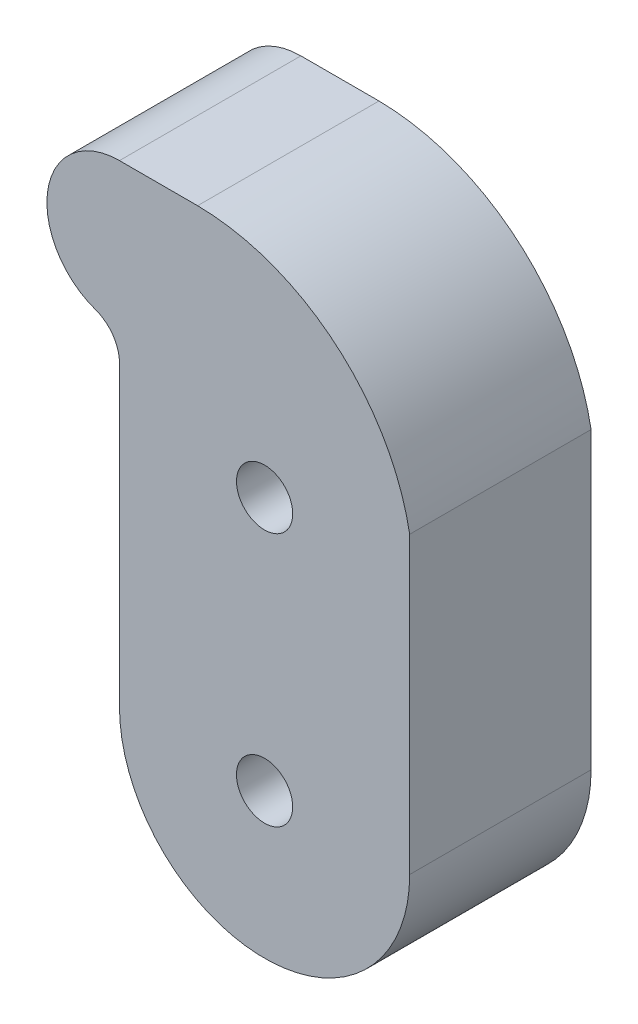
ISO-10303-21;
HEADER;
FILE_DESCRIPTION(('STEP AP214'),'2;1');
FILE_NAME('part.step','',(''),(''),'','','');
FILE_SCHEMA(('AUTOMOTIVE_DESIGN { 1 0 10303 214 1 1 1 1 }'));
ENDSEC;
DATA;
#1=APPLICATION_CONTEXT('core data for automotive mechanical design processes');
#2=APPLICATION_PROTOCOL_DEFINITION('international standard','automotive_design',2000,#1);
#3=PRODUCT_CONTEXT('',#1,'mechanical');
#4=PRODUCT('Part','Part','',(#3));
#5=PRODUCT_RELATED_PRODUCT_CATEGORY('part','',(#4));
#6=PRODUCT_DEFINITION_FORMATION('','',#4);
#7=PRODUCT_DEFINITION_CONTEXT('part definition',#1,'design');
#8=PRODUCT_DEFINITION('design','',#6,#7);
#9=PRODUCT_DEFINITION_SHAPE('','',#8);
#10=(LENGTH_UNIT() NAMED_UNIT(*) SI_UNIT(.MILLI.,.METRE.));
#11=(NAMED_UNIT(*) PLANE_ANGLE_UNIT() SI_UNIT($,.RADIAN.));
#12=(NAMED_UNIT(*) SI_UNIT($,.STERADIAN.) SOLID_ANGLE_UNIT());
#13=UNCERTAINTY_MEASURE_WITH_UNIT(LENGTH_MEASURE(1.E-05),#10,'distance_accuracy_value','');
#14=(GEOMETRIC_REPRESENTATION_CONTEXT(3) GLOBAL_UNCERTAINTY_ASSIGNED_CONTEXT((#13)) GLOBAL_UNIT_ASSIGNED_CONTEXT((#10,
#11,#12)) REPRESENTATION_CONTEXT('',''));
#15=CARTESIAN_POINT('',(0.,0.,0.));
#16=DIRECTION('',(0.,0.,1.));
#17=DIRECTION('',(1.,0.,0.));
#18=AXIS2_PLACEMENT_3D('',#15,#16,#17);
#19=CARTESIAN_POINT('',(-179.23884135027,71.6176801502978,10.));
#20=DIRECTION('',(0.,0.,1.));
#21=DIRECTION('',(1.,0.,0.));
#22=AXIS2_PLACEMENT_3D('',#19,#20,#21);
#23=PLANE('',#22);
#24=CARTESIAN_POINT('',(-175.434880274015,57.530770571063,10.));
#25=DIRECTION('',(0.,0.,1.));
#26=DIRECTION('',(1.,0.,0.));
#27=AXIS2_PLACEMENT_3D('',#24,#25,#26);
#28=CIRCLE('',#27,1.5499999999994);
#29=CARTESIAN_POINT('',(-173.884880274016,57.530770571063,10.));
#30=VERTEX_POINT('',#29);
#31=EDGE_CURVE('E130',#30,#30,#28,.T.);
#32=ORIENTED_EDGE('',*,*,#31,.F.);
#33=EDGE_LOOP('',(#32));
#34=FACE_BOUND('',#33,.T.);
#35=CARTESIAN_POINT('',(-179.23884135027,71.6176801502978,10.));
#36=DIRECTION('',(0.,0.,1.));
#37=DIRECTION('',(1.,0.,0.));
#38=AXIS2_PLACEMENT_3D('',#35,#36,#37);
#39=CIRCLE('',#38,12.);
#40=CARTESIAN_POINT('',(-167.434880274016,73.7778891471937,10.));
#41=VERTEX_POINT('',#40);
#42=CARTESIAN_POINT('',(-179.126801066159,83.6171570961791,10.));
#43=VERTEX_POINT('',#42);
#44=EDGE_CURVE('E139',#41,#43,#39,.T.);
#45=ORIENTED_EDGE('',*,*,#44,.T.);
#46=DIRECTION('',(-1.,0.,0.));
#47=VECTOR('',#46,1.);
#48=CARTESIAN_POINT('',(-179.126801066159,83.6171570961791,10.));
#49=LINE('',#48,#47);
#50=CARTESIAN_POINT('',(-183.434880274016,83.6171570961791,10.));
#51=VERTEX_POINT('',#50);
#52=EDGE_CURVE('E92',#43,#51,#49,.T.);
#53=ORIENTED_EDGE('',*,*,#52,.T.);
#54=CARTESIAN_POINT('',(-183.434880274013,79.6171570961765,10.));
#55=DIRECTION('',(0.,0.,1.));
#56=DIRECTION('',(1.,0.,0.));
#57=AXIS2_PLACEMENT_3D('',#54,#55,#56);
#58=CIRCLE('',#57,4.00000000000237);
#59=CARTESIAN_POINT('',(-184.768213607349,75.8459209298465,10.));
#60=VERTEX_POINT('',#59);
#61=EDGE_CURVE('E151',#51,#60,#58,.T.);
#62=ORIENTED_EDGE('',*,*,#61,.T.);
#63=CARTESIAN_POINT('',(-185.434880274016,73.9603028466822,10.));
#64=DIRECTION('',(0.,0.,-1.));
#65=DIRECTION('',(1.,0.,0.));
#66=AXIS2_PLACEMENT_3D('',#63,#64,#65);
#67=CIRCLE('',#66,2.00000000000058);
#68=CARTESIAN_POINT('',(-183.434880274015,73.9603028466835,10.));
#69=VERTEX_POINT('',#68);
#70=EDGE_CURVE('E108',#60,#69,#67,.T.);
#71=ORIENTED_EDGE('',*,*,#70,.T.);
#72=DIRECTION('',(0.,-1.,0.));
#73=VECTOR('',#72,1.);
#74=CARTESIAN_POINT('',(-183.434880274015,73.9603028466835,10.));
#75=LINE('',#74,#73);
#76=CARTESIAN_POINT('',(-183.434880274015,57.530770571061,10.));
#77=VERTEX_POINT('',#76);
#78=EDGE_CURVE('E102',#69,#77,#75,.T.);
#79=ORIENTED_EDGE('',*,*,#78,.T.);
#80=CARTESIAN_POINT('',(-175.434880274015,57.530770571063,10.));
#81=DIRECTION('',(0.,0.,1.));
#82=DIRECTION('',(1.,0.,0.));
#83=AXIS2_PLACEMENT_3D('',#80,#81,#82);
#84=CIRCLE('',#83,7.99999999999984);
#85=CARTESIAN_POINT('',(-167.434880274015,57.5307705710631,10.));
#86=VERTEX_POINT('',#85);
#87=EDGE_CURVE('E106',#77,#86,#84,.T.);
#88=ORIENTED_EDGE('',*,*,#87,.T.);
#89=DIRECTION('',(0.,1.,0.));
#90=VECTOR('',#89,1.);
#91=CARTESIAN_POINT('',(-167.434880274015,57.5307705710631,10.));
#92=LINE('',#91,#90);
#93=EDGE_CURVE('E52',#86,#41,#92,.T.);
#94=ORIENTED_EDGE('',*,*,#93,.T.);
#95=EDGE_LOOP('',(#45,#53,#62,#71,#79,#88,#94));
#96=FACE_BOUND('',#95,.T.);
#97=CARTESIAN_POINT('',(-175.434880274019,71.530770571063,10.));
#98=DIRECTION('',(0.,0.,1.));
#99=DIRECTION('',(1.,0.,0.));
#100=AXIS2_PLACEMENT_3D('',#97,#98,#99);
#101=CIRCLE('',#100,1.55000000000065);
#102=CARTESIAN_POINT('',(-173.884880274018,71.530770571063,10.));
#103=VERTEX_POINT('',#102);
#104=EDGE_CURVE('E166',#103,#103,#101,.T.);
#105=ORIENTED_EDGE('',*,*,#104,.F.);
#106=EDGE_LOOP('',(#105));
#107=FACE_BOUND('',#106,.T.);
#108=ADVANCED_FACE('F35',(#34,#96,#107),#23,.T.);
#109=CARTESIAN_POINT('',(-179.23884135027,71.6176801502978,0.));
#110=DIRECTION('',(0.,0.,1.));
#111=DIRECTION('',(1.,0.,0.));
#112=AXIS2_PLACEMENT_3D('',#109,#110,#111);
#113=PLANE('',#112);
#114=CARTESIAN_POINT('',(-175.434880274015,57.530770571063,0.));
#115=DIRECTION('',(0.,0.,1.));
#116=DIRECTION('',(1.,0.,0.));
#117=AXIS2_PLACEMENT_3D('',#114,#115,#116);
#118=CIRCLE('',#117,1.5499999999994);
#119=CARTESIAN_POINT('',(-173.884880274016,57.530770571063,0.));
#120=VERTEX_POINT('',#119);
#121=EDGE_CURVE('E163',#120,#120,#118,.T.);
#122=ORIENTED_EDGE('',*,*,#121,.T.);
#123=EDGE_LOOP('',(#122));
#124=FACE_BOUND('',#123,.T.);
#125=CARTESIAN_POINT('',(-179.23884135027,71.6176801502978,0.));
#126=DIRECTION('',(0.,0.,1.));
#127=DIRECTION('',(1.,0.,0.));
#128=AXIS2_PLACEMENT_3D('',#125,#126,#127);
#129=CIRCLE('',#128,12.);
#130=CARTESIAN_POINT('',(-167.434880274016,73.7778891471937,0.));
#131=VERTEX_POINT('',#130);
#132=CARTESIAN_POINT('',(-179.126801066159,83.6171570961791,0.));
#133=VERTEX_POINT('',#132);
#134=EDGE_CURVE('E126',#131,#133,#129,.T.);
#135=ORIENTED_EDGE('',*,*,#134,.F.);
#136=DIRECTION('',(0.,1.,0.));
#137=VECTOR('',#136,1.);
#138=CARTESIAN_POINT('',(-167.434880274015,57.5307705710631,0.));
#139=LINE('',#138,#137);
#140=CARTESIAN_POINT('',(-167.434880274015,57.5307705710631,0.));
#141=VERTEX_POINT('',#140);
#142=EDGE_CURVE('E84',#141,#131,#139,.T.);
#143=ORIENTED_EDGE('',*,*,#142,.F.);
#144=CARTESIAN_POINT('',(-175.434880274015,57.530770571063,0.));
#145=DIRECTION('',(0.,0.,1.));
#146=DIRECTION('',(1.,0.,0.));
#147=AXIS2_PLACEMENT_3D('',#144,#145,#146);
#148=CIRCLE('',#147,7.99999999999984);
#149=CARTESIAN_POINT('',(-183.434880274015,57.530770571061,0.));
#150=VERTEX_POINT('',#149);
#151=EDGE_CURVE('E78',#150,#141,#148,.T.);
#152=ORIENTED_EDGE('',*,*,#151,.F.);
#153=DIRECTION('',(0.,-1.,0.));
#154=VECTOR('',#153,1.);
#155=CARTESIAN_POINT('',(-183.434880274015,73.9603028466835,0.));
#156=LINE('',#155,#154);
#157=CARTESIAN_POINT('',(-183.434880274015,73.9603028466835,0.));
#158=VERTEX_POINT('',#157);
#159=EDGE_CURVE('E116',#158,#150,#156,.T.);
#160=ORIENTED_EDGE('',*,*,#159,.F.);
#161=CARTESIAN_POINT('',(-185.434880274016,73.9603028466822,0.));
#162=DIRECTION('',(0.,0.,-1.));
#163=DIRECTION('',(1.,0.,0.));
#164=AXIS2_PLACEMENT_3D('',#161,#162,#163);
#165=CIRCLE('',#164,2.00000000000058);
#166=CARTESIAN_POINT('',(-184.768213607349,75.8459209298465,0.));
#167=VERTEX_POINT('',#166);
#168=EDGE_CURVE('E134',#167,#158,#165,.T.);
#169=ORIENTED_EDGE('',*,*,#168,.F.);
#170=CARTESIAN_POINT('',(-183.434880274013,79.6171570961765,0.));
#171=DIRECTION('',(0.,0.,1.));
#172=DIRECTION('',(1.,0.,0.));
#173=AXIS2_PLACEMENT_3D('',#170,#171,#172);
#174=CIRCLE('',#173,4.00000000000237);
#175=CARTESIAN_POINT('',(-183.434880274016,83.6171570961791,0.));
#176=VERTEX_POINT('',#175);
#177=EDGE_CURVE('E132',#176,#167,#174,.T.);
#178=ORIENTED_EDGE('',*,*,#177,.F.);
#179=DIRECTION('',(-1.,0.,0.));
#180=VECTOR('',#179,1.);
#181=CARTESIAN_POINT('',(-179.126801066159,83.6171570961791,0.));
#182=LINE('',#181,#180);
#183=EDGE_CURVE('E129',#133,#176,#182,.T.);
#184=ORIENTED_EDGE('',*,*,#183,.F.);
#185=EDGE_LOOP('',(#135,#143,#152,#160,#169,#178,#184));
#186=FACE_BOUND('',#185,.T.);
#187=CARTESIAN_POINT('',(-175.434880274019,71.530770571063,0.));
#188=DIRECTION('',(0.,0.,1.));
#189=DIRECTION('',(1.,0.,0.));
#190=AXIS2_PLACEMENT_3D('',#187,#188,#189);
#191=CIRCLE('',#190,1.55000000000065);
#192=CARTESIAN_POINT('',(-173.884880274018,71.530770571063,0.));
#193=VERTEX_POINT('',#192);
#194=EDGE_CURVE('E169',#193,#193,#191,.T.);
#195=ORIENTED_EDGE('',*,*,#194,.T.);
#196=EDGE_LOOP('',(#195));
#197=FACE_BOUND('',#196,.T.);
#198=ADVANCED_FACE('F155',(#124,#186,#197),#113,.F.);
#199=CARTESIAN_POINT('',(-179.23884135027,71.6176801502978,10.));
#200=DIRECTION('',(0.,0.,-1.));
#201=DIRECTION('',(-1.,0.,0.));
#202=AXIS2_PLACEMENT_3D('',#199,#200,#201);
#203=CYLINDRICAL_SURFACE('',#202,12.);
#204=ORIENTED_EDGE('',*,*,#134,.T.);
#205=DIRECTION('',(0.,0.,-1.));
#206=VECTOR('',#205,1.);
#207=CARTESIAN_POINT('',(-179.126801066159,83.6171570961791,10.));
#208=LINE('',#207,#206);
#209=EDGE_CURVE('E11',#43,#133,#208,.T.);
#210=ORIENTED_EDGE('',*,*,#209,.F.);
#211=ORIENTED_EDGE('',*,*,#44,.F.);
#212=DIRECTION('',(0.,0.,-1.));
#213=VECTOR('',#212,1.);
#214=CARTESIAN_POINT('',(-167.434880274016,73.7778891471937,10.));
#215=LINE('',#214,#213);
#216=EDGE_CURVE('E122',#41,#131,#215,.T.);
#217=ORIENTED_EDGE('',*,*,#216,.T.);
#218=EDGE_LOOP('',(#204,#210,#211,#217));
#219=FACE_BOUND('',#218,.T.);
#220=ADVANCED_FACE('F37',(#219),#203,.T.);
#221=CARTESIAN_POINT('',(-179.126801066159,83.6171570961791,10.));
#222=DIRECTION('',(0.,-1.,0.));
#223=DIRECTION('',(1.,0.,0.));
#224=AXIS2_PLACEMENT_3D('',#221,#222,#223);
#225=PLANE('',#224);
#226=ORIENTED_EDGE('',*,*,#183,.T.);
#227=DIRECTION('',(0.,0.,-1.));
#228=VECTOR('',#227,1.);
#229=CARTESIAN_POINT('',(-183.434880274016,83.6171570961791,10.));
#230=LINE('',#229,#228);
#231=EDGE_CURVE('E44',#51,#176,#230,.T.);
#232=ORIENTED_EDGE('',*,*,#231,.F.);
#233=ORIENTED_EDGE('',*,*,#52,.F.);
#234=ORIENTED_EDGE('',*,*,#209,.T.);
#235=EDGE_LOOP('',(#226,#232,#233,#234));
#236=FACE_BOUND('',#235,.T.);
#237=ADVANCED_FACE('F200',(#236),#225,.F.);
#238=CARTESIAN_POINT('',(-183.434880274013,79.6171570961765,10.));
#239=DIRECTION('',(0.,0.,-1.));
#240=DIRECTION('',(-1.,0.,0.));
#241=AXIS2_PLACEMENT_3D('',#238,#239,#240);
#242=CYLINDRICAL_SURFACE('',#241,4.00000000000237);
#243=ORIENTED_EDGE('',*,*,#177,.T.);
#244=DIRECTION('',(0.,0.,-1.));
#245=VECTOR('',#244,1.);
#246=CARTESIAN_POINT('',(-184.768213607349,75.8459209298465,10.));
#247=LINE('',#246,#245);
#248=EDGE_CURVE('E143',#60,#167,#247,.T.);
#249=ORIENTED_EDGE('',*,*,#248,.F.);
#250=ORIENTED_EDGE('',*,*,#61,.F.);
#251=ORIENTED_EDGE('',*,*,#231,.T.);
#252=EDGE_LOOP('',(#243,#249,#250,#251));
#253=FACE_BOUND('',#252,.T.);
#254=ADVANCED_FACE('F149',(#253),#242,.T.);
#255=CARTESIAN_POINT('',(-185.434880274016,73.9603028466822,10.));
#256=DIRECTION('',(0.,0.,-1.));
#257=DIRECTION('',(-1.,0.,0.));
#258=AXIS2_PLACEMENT_3D('',#255,#256,#257);
#259=CYLINDRICAL_SURFACE('',#258,2.00000000000058);
#260=ORIENTED_EDGE('',*,*,#168,.T.);
#261=DIRECTION('',(0.,0.,-1.));
#262=VECTOR('',#261,1.);
#263=CARTESIAN_POINT('',(-183.434880274015,73.9603028466835,10.));
#264=LINE('',#263,#262);
#265=EDGE_CURVE('E117',#69,#158,#264,.T.);
#266=ORIENTED_EDGE('',*,*,#265,.F.);
#267=ORIENTED_EDGE('',*,*,#70,.F.);
#268=ORIENTED_EDGE('',*,*,#248,.T.);
#269=EDGE_LOOP('',(#260,#266,#267,#268));
#270=FACE_BOUND('',#269,.T.);
#271=ADVANCED_FACE('F158',(#270),#259,.F.);
#272=CARTESIAN_POINT('',(-183.434880274015,73.9603028466835,10.));
#273=DIRECTION('',(1.,0.,0.));
#274=DIRECTION('',(0.,1.,0.));
#275=AXIS2_PLACEMENT_3D('',#272,#273,#274);
#276=PLANE('',#275);
#277=ORIENTED_EDGE('',*,*,#159,.T.);
#278=DIRECTION('',(0.,0.,-1.));
#279=VECTOR('',#278,1.);
#280=CARTESIAN_POINT('',(-183.434880274015,57.530770571061,10.));
#281=LINE('',#280,#279);
#282=EDGE_CURVE('E113',#77,#150,#281,.T.);
#283=ORIENTED_EDGE('',*,*,#282,.F.);
#284=ORIENTED_EDGE('',*,*,#78,.F.);
#285=ORIENTED_EDGE('',*,*,#265,.T.);
#286=EDGE_LOOP('',(#277,#283,#284,#285));
#287=FACE_BOUND('',#286,.T.);
#288=ADVANCED_FACE('F114',(#287),#276,.F.);
#289=CARTESIAN_POINT('',(-175.434880274015,57.530770571063,10.));
#290=DIRECTION('',(0.,0.,-1.));
#291=DIRECTION('',(-1.,0.,0.));
#292=AXIS2_PLACEMENT_3D('',#289,#290,#291);
#293=CYLINDRICAL_SURFACE('',#292,7.99999999999984);
#294=ORIENTED_EDGE('',*,*,#151,.T.);
#295=DIRECTION('',(0.,0.,-1.));
#296=VECTOR('',#295,1.);
#297=CARTESIAN_POINT('',(-167.434880274015,57.5307705710631,10.));
#298=LINE('',#297,#296);
#299=EDGE_CURVE('E118',#86,#141,#298,.T.);
#300=ORIENTED_EDGE('',*,*,#299,.F.);
#301=ORIENTED_EDGE('',*,*,#87,.F.);
#302=ORIENTED_EDGE('',*,*,#282,.T.);
#303=EDGE_LOOP('',(#294,#300,#301,#302));
#304=FACE_BOUND('',#303,.T.);
#305=ADVANCED_FACE('F120',(#304),#293,.T.);
#306=CARTESIAN_POINT('',(-167.434880274015,57.5307705710631,10.));
#307=DIRECTION('',(-1.,0.,0.));
#308=DIRECTION('',(0.,-1.,0.));
#309=AXIS2_PLACEMENT_3D('',#306,#307,#308);
#310=PLANE('',#309);
#311=ORIENTED_EDGE('',*,*,#142,.T.);
#312=ORIENTED_EDGE('',*,*,#216,.F.);
#313=ORIENTED_EDGE('',*,*,#93,.F.);
#314=ORIENTED_EDGE('',*,*,#299,.T.);
#315=EDGE_LOOP('',(#311,#312,#313,#314));
#316=FACE_BOUND('',#315,.T.);
#317=ADVANCED_FACE('F190',(#316),#310,.F.);
#318=CARTESIAN_POINT('',(-175.434880274015,57.530770571063,10.));
#319=DIRECTION('',(0.,0.,-1.));
#320=DIRECTION('',(-1.,0.,0.));
#321=AXIS2_PLACEMENT_3D('',#318,#319,#320);
#322=CYLINDRICAL_SURFACE('',#321,1.5499999999994);
#323=ORIENTED_EDGE('',*,*,#31,.T.);
#324=EDGE_LOOP('',(#323));
#325=FACE_BOUND('',#324,.T.);
#326=ORIENTED_EDGE('',*,*,#121,.F.);
#327=EDGE_LOOP('',(#326));
#328=FACE_BOUND('',#327,.T.);
#329=ADVANCED_FACE('F187',(#325,#328),#322,.F.);
#330=CARTESIAN_POINT('',(-175.434880274019,71.530770571063,10.));
#331=DIRECTION('',(0.,0.,-1.));
#332=DIRECTION('',(-1.,0.,0.));
#333=AXIS2_PLACEMENT_3D('',#330,#331,#332);
#334=CYLINDRICAL_SURFACE('',#333,1.55000000000065);
#335=ORIENTED_EDGE('',*,*,#104,.T.);
#336=EDGE_LOOP('',(#335));
#337=FACE_BOUND('',#336,.T.);
#338=ORIENTED_EDGE('',*,*,#194,.F.);
#339=EDGE_LOOP('',(#338));
#340=FACE_BOUND('',#339,.T.);
#341=ADVANCED_FACE('F175',(#337,#340),#334,.F.);
#342=CLOSED_SHELL('',(#108,#198,#220,#237,#254,#271,#288,#305,#317,#329,#341));
#343=MANIFOLD_SOLID_BREP('B2',#342);
#344=ADVANCED_BREP_SHAPE_REPRESENTATION('',(#18,#343),#14);
#345=SHAPE_DEFINITION_REPRESENTATION(#9,#344);
ENDSEC;
END-ISO-10303-21;
